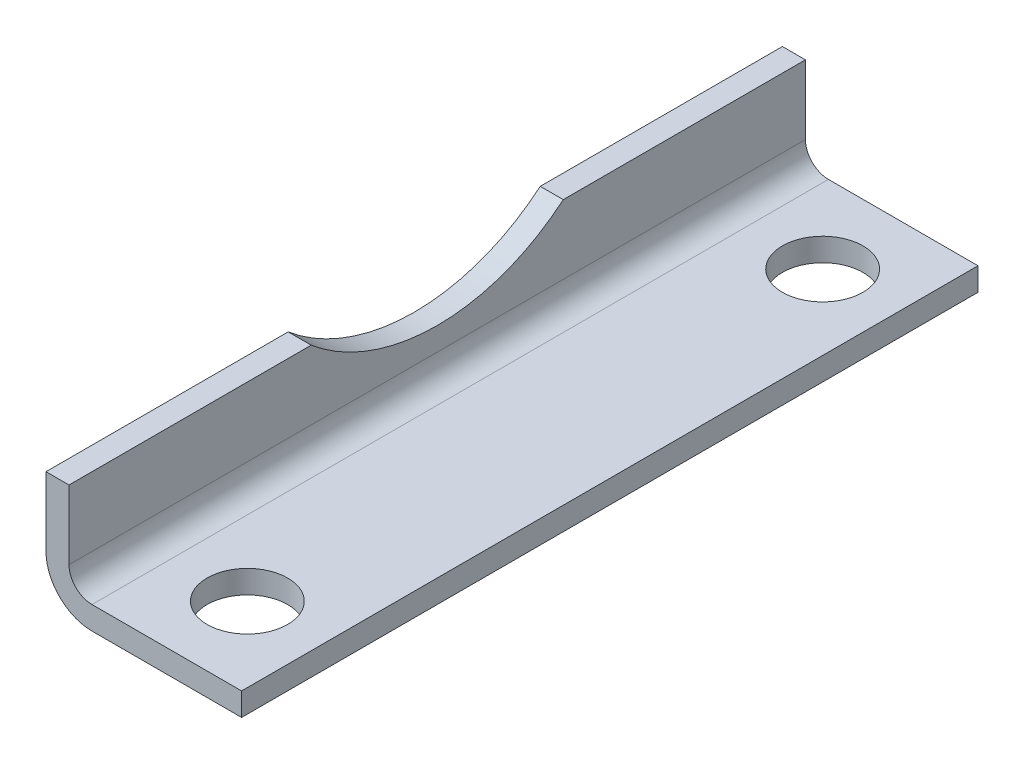
ISO-10303-21;
HEADER;
FILE_DESCRIPTION(('STEP AP214'),'2;1');
FILE_NAME('part.step','',(''),(''),'','','');
FILE_SCHEMA(('AUTOMOTIVE_DESIGN { 1 0 10303 214 1 1 1 1 }'));
ENDSEC;
DATA;
#1=APPLICATION_CONTEXT('core data for automotive mechanical design processes');
#2=APPLICATION_PROTOCOL_DEFINITION('international standard','automotive_design',2000,#1);
#3=PRODUCT_CONTEXT('',#1,'mechanical');
#4=PRODUCT('Part','Part','',(#3));
#5=PRODUCT_RELATED_PRODUCT_CATEGORY('part','',(#4));
#6=PRODUCT_DEFINITION_FORMATION('','',#4);
#7=PRODUCT_DEFINITION_CONTEXT('part definition',#1,'design');
#8=PRODUCT_DEFINITION('design','',#6,#7);
#9=PRODUCT_DEFINITION_SHAPE('','',#8);
#10=(LENGTH_UNIT() NAMED_UNIT(*) SI_UNIT(.MILLI.,.METRE.));
#11=(NAMED_UNIT(*) PLANE_ANGLE_UNIT() SI_UNIT($,.RADIAN.));
#12=(NAMED_UNIT(*) SI_UNIT($,.STERADIAN.) SOLID_ANGLE_UNIT());
#13=UNCERTAINTY_MEASURE_WITH_UNIT(LENGTH_MEASURE(1.E-05),#10,'distance_accuracy_value','');
#14=(GEOMETRIC_REPRESENTATION_CONTEXT(3) GLOBAL_UNCERTAINTY_ASSIGNED_CONTEXT((#13)) GLOBAL_UNIT_ASSIGNED_CONTEXT((#10,
#11,#12)) REPRESENTATION_CONTEXT('',''));
#15=CARTESIAN_POINT('',(0.,0.,0.));
#16=DIRECTION('',(0.,0.,1.));
#17=DIRECTION('',(1.,0.,0.));
#18=AXIS2_PLACEMENT_3D('',#15,#16,#17);
#19=CARTESIAN_POINT('',(2.,10.,32.));
#20=DIRECTION('',(0.,-1.,0.));
#21=DIRECTION('',(0.,0.,-1.));
#22=AXIS2_PLACEMENT_3D('',#19,#20,#21);
#23=PLANE('',#22);
#24=DIRECTION('',(0.,0.,-1.));
#25=VECTOR('',#24,1.);
#26=CARTESIAN_POINT('',(2.,10.,32.));
#27=LINE('',#26,#25);
#28=CARTESIAN_POINT('',(2.,10.,32.));
#29=VERTEX_POINT('',#28);
#30=CARTESIAN_POINT('',(2.,10.,10.9544511501033));
#31=VERTEX_POINT('',#30);
#32=EDGE_CURVE('E128',#29,#31,#27,.T.);
#33=ORIENTED_EDGE('',*,*,#32,.T.);
#34=DIRECTION('',(-1.,0.,0.));
#35=VECTOR('',#34,1.);
#36=CARTESIAN_POINT('',(10.,10.,10.9544511501033));
#37=LINE('',#36,#35);
#38=CARTESIAN_POINT('',(0.,10.,10.9544511501033));
#39=VERTEX_POINT('',#38);
#40=EDGE_CURVE('E115',#31,#39,#37,.T.);
#41=ORIENTED_EDGE('',*,*,#40,.T.);
#42=DIRECTION('',(0.,0.,-1.));
#43=VECTOR('',#42,1.);
#44=CARTESIAN_POINT('',(0.,10.,32.));
#45=LINE('',#44,#43);
#46=CARTESIAN_POINT('',(0.,10.,32.));
#47=VERTEX_POINT('',#46);
#48=EDGE_CURVE('E125',#47,#39,#45,.T.);
#49=ORIENTED_EDGE('',*,*,#48,.F.);
#50=DIRECTION('',(-1.,0.,0.));
#51=VECTOR('',#50,1.);
#52=CARTESIAN_POINT('',(2.,10.,32.));
#53=LINE('',#52,#51);
#54=EDGE_CURVE('E185',#29,#47,#53,.T.);
#55=ORIENTED_EDGE('',*,*,#54,.F.);
#56=EDGE_LOOP('',(#33,#41,#49,#55));
#57=FACE_BOUND('',#56,.T.);
#58=ADVANCED_FACE('F35',(#57),#23,.F.);
#59=CARTESIAN_POINT('',(0.,0.,32.));
#60=DIRECTION('',(0.,1.,0.));
#61=DIRECTION('',(0.,0.,1.));
#62=AXIS2_PLACEMENT_3D('',#59,#60,#61);
#63=PLANE('',#62);
#64=CARTESIAN_POINT('',(10.5,0.,-25.));
#65=DIRECTION('',(0.,-1.,0.));
#66=DIRECTION('',(0.,0.,1.));
#67=AXIS2_PLACEMENT_3D('',#64,#65,#66);
#68=CIRCLE('',#67,3.5);
#69=CARTESIAN_POINT('',(10.5,0.,-21.5));
#70=VERTEX_POINT('',#69);
#71=EDGE_CURVE('E129',#70,#70,#68,.T.);
#72=ORIENTED_EDGE('',*,*,#71,.F.);
#73=EDGE_LOOP('',(#72));
#74=FACE_BOUND('',#73,.T.);
#75=CARTESIAN_POINT('',(10.5,0.,25.));
#76=DIRECTION('',(0.,-1.,0.));
#77=DIRECTION('',(0.,0.,-1.));
#78=AXIS2_PLACEMENT_3D('',#75,#76,#77);
#79=CIRCLE('',#78,3.5);
#80=CARTESIAN_POINT('',(10.5,0.,21.5));
#81=VERTEX_POINT('',#80);
#82=EDGE_CURVE('E165',#81,#81,#79,.T.);
#83=ORIENTED_EDGE('',*,*,#82,.F.);
#84=EDGE_LOOP('',(#83));
#85=FACE_BOUND('',#84,.T.);
#86=DIRECTION('',(1.,0.,0.));
#87=VECTOR('',#86,1.);
#88=CARTESIAN_POINT('',(0.,0.,32.));
#89=LINE('',#88,#87);
#90=CARTESIAN_POINT('',(4.,0.,32.));
#91=VERTEX_POINT('',#90);
#92=CARTESIAN_POINT('',(17.,0.,32.));
#93=VERTEX_POINT('',#92);
#94=EDGE_CURVE('E177',#91,#93,#89,.T.);
#95=ORIENTED_EDGE('',*,*,#94,.F.);
#96=DIRECTION('',(0.,0.,-1.));
#97=VECTOR('',#96,1.);
#98=CARTESIAN_POINT('',(4.,0.,32.));
#99=LINE('',#98,#97);
#100=CARTESIAN_POINT('',(4.,0.,-32.));
#101=VERTEX_POINT('',#100);
#102=EDGE_CURVE('E149',#91,#101,#99,.T.);
#103=ORIENTED_EDGE('',*,*,#102,.T.);
#104=DIRECTION('',(1.,0.,0.));
#105=VECTOR('',#104,1.);
#106=CARTESIAN_POINT('',(0.,0.,-32.));
#107=LINE('',#106,#105);
#108=CARTESIAN_POINT('',(17.,0.,-32.));
#109=VERTEX_POINT('',#108);
#110=EDGE_CURVE('E164',#101,#109,#107,.T.);
#111=ORIENTED_EDGE('',*,*,#110,.T.);
#112=DIRECTION('',(0.,0.,-1.));
#113=VECTOR('',#112,1.);
#114=CARTESIAN_POINT('',(17.,0.,32.));
#115=LINE('',#114,#113);
#116=EDGE_CURVE('E146',#93,#109,#115,.T.);
#117=ORIENTED_EDGE('',*,*,#116,.F.);
#118=EDGE_LOOP('',(#95,#103,#111,#117));
#119=FACE_BOUND('',#118,.T.);
#120=ADVANCED_FACE('F211',(#74,#85,#119),#63,.F.);
#121=CARTESIAN_POINT('',(17.,0.,32.));
#122=DIRECTION('',(-1.,0.,0.));
#123=DIRECTION('',(0.,0.,1.));
#124=AXIS2_PLACEMENT_3D('',#121,#122,#123);
#125=PLANE('',#124);
#126=DIRECTION('',(0.,1.,0.));
#127=VECTOR('',#126,1.);
#128=CARTESIAN_POINT('',(17.,0.,-32.));
#129=LINE('',#128,#127);
#130=CARTESIAN_POINT('',(17.,2.,-32.));
#131=VERTEX_POINT('',#130);
#132=EDGE_CURVE('E168',#109,#131,#129,.T.);
#133=ORIENTED_EDGE('',*,*,#132,.T.);
#134=DIRECTION('',(0.,0.,-1.));
#135=VECTOR('',#134,1.);
#136=CARTESIAN_POINT('',(17.,2.,32.));
#137=LINE('',#136,#135);
#138=CARTESIAN_POINT('',(17.,2.,32.));
#139=VERTEX_POINT('',#138);
#140=EDGE_CURVE('E143',#139,#131,#137,.T.);
#141=ORIENTED_EDGE('',*,*,#140,.F.);
#142=DIRECTION('',(0.,1.,0.));
#143=VECTOR('',#142,1.);
#144=CARTESIAN_POINT('',(17.,0.,32.));
#145=LINE('',#144,#143);
#146=EDGE_CURVE('E179',#93,#139,#145,.T.);
#147=ORIENTED_EDGE('',*,*,#146,.F.);
#148=ORIENTED_EDGE('',*,*,#116,.T.);
#149=EDGE_LOOP('',(#133,#141,#147,#148));
#150=FACE_BOUND('',#149,.T.);
#151=ADVANCED_FACE('F215',(#150),#125,.F.);
#152=CARTESIAN_POINT('',(17.,2.,32.));
#153=DIRECTION('',(0.,-1.,0.));
#154=DIRECTION('',(1.,0.,0.));
#155=AXIS2_PLACEMENT_3D('',#152,#153,#154);
#156=PLANE('',#155);
#157=CARTESIAN_POINT('',(10.5,2.,-25.));
#158=DIRECTION('',(0.,-1.,0.));
#159=DIRECTION('',(1.,0.,0.));
#160=AXIS2_PLACEMENT_3D('',#157,#158,#159);
#161=CIRCLE('',#160,3.5);
#162=CARTESIAN_POINT('',(14.,2.,-25.));
#163=VERTEX_POINT('',#162);
#164=EDGE_CURVE('E39',#163,#163,#161,.T.);
#165=ORIENTED_EDGE('',*,*,#164,.T.);
#166=EDGE_LOOP('',(#165));
#167=FACE_BOUND('',#166,.T.);
#168=CARTESIAN_POINT('',(10.5,2.,25.));
#169=DIRECTION('',(0.,-1.,0.));
#170=DIRECTION('',(1.,0.,0.));
#171=AXIS2_PLACEMENT_3D('',#168,#169,#170);
#172=CIRCLE('',#171,3.5);
#173=CARTESIAN_POINT('',(14.,2.,25.));
#174=VERTEX_POINT('',#173);
#175=EDGE_CURVE('E162',#174,#174,#172,.T.);
#176=ORIENTED_EDGE('',*,*,#175,.T.);
#177=EDGE_LOOP('',(#176));
#178=FACE_BOUND('',#177,.T.);
#179=DIRECTION('',(-1.,0.,0.));
#180=VECTOR('',#179,1.);
#181=CARTESIAN_POINT('',(17.,2.,-32.));
#182=LINE('',#181,#180);
#183=CARTESIAN_POINT('',(4.,2.,-32.));
#184=VERTEX_POINT('',#183);
#185=EDGE_CURVE('E189',#131,#184,#182,.T.);
#186=ORIENTED_EDGE('',*,*,#185,.T.);
#187=DIRECTION('',(0.,0.,-1.));
#188=VECTOR('',#187,1.);
#189=CARTESIAN_POINT('',(4.,2.,32.));
#190=LINE('',#189,#188);
#191=CARTESIAN_POINT('',(4.,2.,32.));
#192=VERTEX_POINT('',#191);
#193=EDGE_CURVE('E60',#184,#192,#190,.F.);
#194=ORIENTED_EDGE('',*,*,#193,.T.);
#195=DIRECTION('',(-1.,0.,0.));
#196=VECTOR('',#195,1.);
#197=CARTESIAN_POINT('',(17.,2.,32.));
#198=LINE('',#197,#196);
#199=EDGE_CURVE('E181',#139,#192,#198,.T.);
#200=ORIENTED_EDGE('',*,*,#199,.F.);
#201=ORIENTED_EDGE('',*,*,#140,.T.);
#202=EDGE_LOOP('',(#186,#194,#200,#201));
#203=FACE_BOUND('',#202,.T.);
#204=ADVANCED_FACE('F227',(#167,#178,#203),#156,.F.);
#205=CARTESIAN_POINT('',(2.,2.,32.));
#206=DIRECTION('',(-1.,0.,0.));
#207=DIRECTION('',(0.,0.,1.));
#208=AXIS2_PLACEMENT_3D('',#205,#206,#207);
#209=PLANE('',#208);
#210=CARTESIAN_POINT('',(2.,10.,-10.9544511501033));
#211=VERTEX_POINT('',#210);
#212=CARTESIAN_POINT('',(2.,10.,-32.));
#213=VERTEX_POINT('',#212);
#214=EDGE_CURVE('E135',#211,#213,#27,.T.);
#215=ORIENTED_EDGE('',*,*,#214,.F.);
#216=CARTESIAN_POINT('',(2.,23.,0.));
#217=DIRECTION('',(-1.,0.,0.));
#218=DIRECTION('',(0.,0.,1.));
#219=AXIS2_PLACEMENT_3D('',#216,#217,#218);
#220=CIRCLE('',#219,17.);
#221=EDGE_CURVE('E130',#211,#31,#220,.T.);
#222=ORIENTED_EDGE('',*,*,#221,.T.);
#223=ORIENTED_EDGE('',*,*,#32,.F.);
#224=DIRECTION('',(0.,1.,0.));
#225=VECTOR('',#224,1.);
#226=CARTESIAN_POINT('',(2.,2.,32.));
#227=LINE('',#226,#225);
#228=CARTESIAN_POINT('',(2.,4.,32.));
#229=VERTEX_POINT('',#228);
#230=EDGE_CURVE('E183',#229,#29,#227,.T.);
#231=ORIENTED_EDGE('',*,*,#230,.F.);
#232=DIRECTION('',(0.,0.,-1.));
#233=VECTOR('',#232,1.);
#234=CARTESIAN_POINT('',(2.,4.,-32.));
#235=LINE('',#234,#233);
#236=CARTESIAN_POINT('',(2.,4.,-32.));
#237=VERTEX_POINT('',#236);
#238=EDGE_CURVE('E158',#229,#237,#235,.T.);
#239=ORIENTED_EDGE('',*,*,#238,.T.);
#240=DIRECTION('',(0.,1.,0.));
#241=VECTOR('',#240,1.);
#242=CARTESIAN_POINT('',(2.,2.,-32.));
#243=LINE('',#242,#241);
#244=EDGE_CURVE('E191',#237,#213,#243,.T.);
#245=ORIENTED_EDGE('',*,*,#244,.T.);
#246=EDGE_LOOP('',(#215,#222,#223,#231,#239,#245));
#247=FACE_BOUND('',#246,.T.);
#248=ADVANCED_FACE('F224',(#247),#209,.F.);
#249=CARTESIAN_POINT('',(0.,10.,-10.9544511501033));
#250=VERTEX_POINT('',#249);
#251=CARTESIAN_POINT('',(0.,10.,-32.));
#252=VERTEX_POINT('',#251);
#253=EDGE_CURVE('E136',#250,#252,#45,.T.);
#254=ORIENTED_EDGE('',*,*,#253,.F.);
#255=DIRECTION('',(-1.,0.,0.));
#256=VECTOR('',#255,1.);
#257=CARTESIAN_POINT('',(10.,10.,-10.9544511501033));
#258=LINE('',#257,#256);
#259=EDGE_CURVE('E52',#250,#211,#258,.F.);
#260=ORIENTED_EDGE('',*,*,#259,.T.);
#261=ORIENTED_EDGE('',*,*,#214,.T.);
#262=DIRECTION('',(-1.,0.,0.));
#263=VECTOR('',#262,1.);
#264=CARTESIAN_POINT('',(2.,10.,-32.));
#265=LINE('',#264,#263);
#266=EDGE_CURVE('E193',#213,#252,#265,.T.);
#267=ORIENTED_EDGE('',*,*,#266,.T.);
#268=EDGE_LOOP('',(#254,#260,#261,#267));
#269=FACE_BOUND('',#268,.T.);
#270=ADVANCED_FACE('F236',(#269),#23,.F.);
#271=CARTESIAN_POINT('',(0.,0.,32.));
#272=DIRECTION('',(1.,0.,0.));
#273=DIRECTION('',(0.,0.,-1.));
#274=AXIS2_PLACEMENT_3D('',#271,#272,#273);
#275=PLANE('',#274);
#276=ORIENTED_EDGE('',*,*,#48,.T.);
#277=CARTESIAN_POINT('',(0.,23.,0.));
#278=DIRECTION('',(-1.,0.,0.));
#279=DIRECTION('',(0.,0.,1.));
#280=AXIS2_PLACEMENT_3D('',#277,#278,#279);
#281=CIRCLE('',#280,17.);
#282=EDGE_CURVE('E112',#250,#39,#281,.T.);
#283=ORIENTED_EDGE('',*,*,#282,.F.);
#284=ORIENTED_EDGE('',*,*,#253,.T.);
#285=DIRECTION('',(0.,-1.,0.));
#286=VECTOR('',#285,1.);
#287=CARTESIAN_POINT('',(0.,0.,-32.));
#288=LINE('',#287,#286);
#289=CARTESIAN_POINT('',(0.,4.,-32.));
#290=VERTEX_POINT('',#289);
#291=EDGE_CURVE('E140',#252,#290,#288,.T.);
#292=ORIENTED_EDGE('',*,*,#291,.T.);
#293=DIRECTION('',(0.,0.,-1.));
#294=VECTOR('',#293,1.);
#295=CARTESIAN_POINT('',(0.,4.,32.));
#296=LINE('',#295,#294);
#297=CARTESIAN_POINT('',(0.,4.,32.));
#298=VERTEX_POINT('',#297);
#299=EDGE_CURVE('E154',#290,#298,#296,.F.);
#300=ORIENTED_EDGE('',*,*,#299,.T.);
#301=DIRECTION('',(0.,-1.,0.));
#302=VECTOR('',#301,1.);
#303=CARTESIAN_POINT('',(0.,0.,32.));
#304=LINE('',#303,#302);
#305=EDGE_CURVE('E134',#47,#298,#304,.T.);
#306=ORIENTED_EDGE('',*,*,#305,.F.);
#307=EDGE_LOOP('',(#276,#283,#284,#292,#300,#306));
#308=FACE_BOUND('',#307,.T.);
#309=ADVANCED_FACE('F132',(#308),#275,.F.);
#310=CARTESIAN_POINT('',(0.,0.,32.));
#311=DIRECTION('',(0.,0.,1.));
#312=DIRECTION('',(1.,0.,0.));
#313=AXIS2_PLACEMENT_3D('',#310,#311,#312);
#314=PLANE('',#313);
#315=ORIENTED_EDGE('',*,*,#305,.T.);
#316=CARTESIAN_POINT('',(4.,4.,32.));
#317=DIRECTION('',(0.,0.,1.));
#318=DIRECTION('',(1.,0.,0.));
#319=AXIS2_PLACEMENT_3D('',#316,#317,#318);
#320=CIRCLE('',#319,4.);
#321=EDGE_CURVE('E156',#298,#91,#320,.T.);
#322=ORIENTED_EDGE('',*,*,#321,.T.);
#323=ORIENTED_EDGE('',*,*,#94,.T.);
#324=ORIENTED_EDGE('',*,*,#146,.T.);
#325=ORIENTED_EDGE('',*,*,#199,.T.);
#326=CARTESIAN_POINT('',(4.,4.,32.));
#327=DIRECTION('',(0.,0.,1.));
#328=DIRECTION('',(1.,0.,0.));
#329=AXIS2_PLACEMENT_3D('',#326,#327,#328);
#330=CIRCLE('',#329,2.);
#331=EDGE_CURVE('E11',#192,#229,#330,.F.);
#332=ORIENTED_EDGE('',*,*,#331,.T.);
#333=ORIENTED_EDGE('',*,*,#230,.T.);
#334=ORIENTED_EDGE('',*,*,#54,.T.);
#335=EDGE_LOOP('',(#315,#322,#323,#324,#325,#332,#333,#334));
#336=FACE_BOUND('',#335,.T.);
#337=ADVANCED_FACE('F207',(#336),#314,.T.);
#338=CARTESIAN_POINT('',(0.,0.,-32.));
#339=DIRECTION('',(0.,0.,1.));
#340=DIRECTION('',(1.,0.,0.));
#341=AXIS2_PLACEMENT_3D('',#338,#339,#340);
#342=PLANE('',#341);
#343=ORIENTED_EDGE('',*,*,#110,.F.);
#344=CARTESIAN_POINT('',(4.,4.,-32.));
#345=DIRECTION('',(0.,0.,1.));
#346=DIRECTION('',(1.,0.,0.));
#347=AXIS2_PLACEMENT_3D('',#344,#345,#346);
#348=CIRCLE('',#347,4.);
#349=EDGE_CURVE('E152',#101,#290,#348,.F.);
#350=ORIENTED_EDGE('',*,*,#349,.T.);
#351=ORIENTED_EDGE('',*,*,#291,.F.);
#352=ORIENTED_EDGE('',*,*,#266,.F.);
#353=ORIENTED_EDGE('',*,*,#244,.F.);
#354=CARTESIAN_POINT('',(4.,4.,-32.));
#355=DIRECTION('',(0.,0.,1.));
#356=DIRECTION('',(1.,0.,0.));
#357=AXIS2_PLACEMENT_3D('',#354,#355,#356);
#358=CIRCLE('',#357,2.);
#359=EDGE_CURVE('E44',#237,#184,#358,.T.);
#360=ORIENTED_EDGE('',*,*,#359,.T.);
#361=ORIENTED_EDGE('',*,*,#185,.F.);
#362=ORIENTED_EDGE('',*,*,#132,.F.);
#363=EDGE_LOOP('',(#343,#350,#351,#352,#353,#360,#361,#362));
#364=FACE_BOUND('',#363,.T.);
#365=ADVANCED_FACE('F225',(#364),#342,.F.);
#366=CARTESIAN_POINT('',(4.,4.,32.));
#367=DIRECTION('',(0.,0.,-1.));
#368=DIRECTION('',(-1.,0.,0.));
#369=AXIS2_PLACEMENT_3D('',#366,#367,#368);
#370=CYLINDRICAL_SURFACE('',#369,4.);
#371=ORIENTED_EDGE('',*,*,#321,.F.);
#372=ORIENTED_EDGE('',*,*,#299,.F.);
#373=ORIENTED_EDGE('',*,*,#349,.F.);
#374=ORIENTED_EDGE('',*,*,#102,.F.);
#375=EDGE_LOOP('',(#371,#372,#373,#374));
#376=FACE_BOUND('',#375,.T.);
#377=ADVANCED_FACE('F203',(#376),#370,.T.);
#378=CARTESIAN_POINT('',(4.,4.,32.));
#379=DIRECTION('',(0.,0.,1.));
#380=DIRECTION('',(1.,0.,0.));
#381=AXIS2_PLACEMENT_3D('',#378,#379,#380);
#382=CYLINDRICAL_SURFACE('',#381,2.);
#383=ORIENTED_EDGE('',*,*,#331,.F.);
#384=ORIENTED_EDGE('',*,*,#193,.F.);
#385=ORIENTED_EDGE('',*,*,#359,.F.);
#386=ORIENTED_EDGE('',*,*,#238,.F.);
#387=EDGE_LOOP('',(#383,#384,#385,#386));
#388=FACE_BOUND('',#387,.T.);
#389=ADVANCED_FACE('F37',(#388),#382,.F.);
#390=CARTESIAN_POINT('',(10.5,10.,25.));
#391=DIRECTION('',(0.,-1.,0.));
#392=DIRECTION('',(0.,0.,-1.));
#393=AXIS2_PLACEMENT_3D('',#390,#391,#392);
#394=CYLINDRICAL_SURFACE('',#393,3.5);
#395=ORIENTED_EDGE('',*,*,#82,.T.);
#396=EDGE_LOOP('',(#395));
#397=FACE_BOUND('',#396,.T.);
#398=ORIENTED_EDGE('',*,*,#175,.F.);
#399=EDGE_LOOP('',(#398));
#400=FACE_BOUND('',#399,.T.);
#401=ADVANCED_FACE('F262',(#397,#400),#394,.F.);
#402=CARTESIAN_POINT('',(10.5,10.,-25.));
#403=DIRECTION('',(0.,-1.,0.));
#404=DIRECTION('',(0.,0.,-1.));
#405=AXIS2_PLACEMENT_3D('',#402,#403,#404);
#406=CYLINDRICAL_SURFACE('',#405,3.5);
#407=ORIENTED_EDGE('',*,*,#71,.T.);
#408=EDGE_LOOP('',(#407));
#409=FACE_BOUND('',#408,.T.);
#410=ORIENTED_EDGE('',*,*,#164,.F.);
#411=EDGE_LOOP('',(#410));
#412=FACE_BOUND('',#411,.T.);
#413=ADVANCED_FACE('F265',(#409,#412),#406,.F.);
#414=CARTESIAN_POINT('',(10.,23.,0.));
#415=DIRECTION('',(-1.,0.,0.));
#416=DIRECTION('',(0.,0.,1.));
#417=AXIS2_PLACEMENT_3D('',#414,#415,#416);
#418=CYLINDRICAL_SURFACE('',#417,17.);
#419=ORIENTED_EDGE('',*,*,#221,.F.);
#420=ORIENTED_EDGE('',*,*,#259,.F.);
#421=ORIENTED_EDGE('',*,*,#282,.T.);
#422=ORIENTED_EDGE('',*,*,#40,.F.);
#423=EDGE_LOOP('',(#419,#420,#421,#422));
#424=FACE_BOUND('',#423,.T.);
#425=ADVANCED_FACE('F114',(#424),#418,.F.);
#426=CLOSED_SHELL('',(#58,#120,#151,#204,#248,#270,#309,#337,#365,#377,#389,#401,#413,#425));
#427=MANIFOLD_SOLID_BREP('B2',#426);
#428=ADVANCED_BREP_SHAPE_REPRESENTATION('',(#18,#427),#14);
#429=SHAPE_DEFINITION_REPRESENTATION(#9,#428);
ENDSEC;
END-ISO-10303-21;
